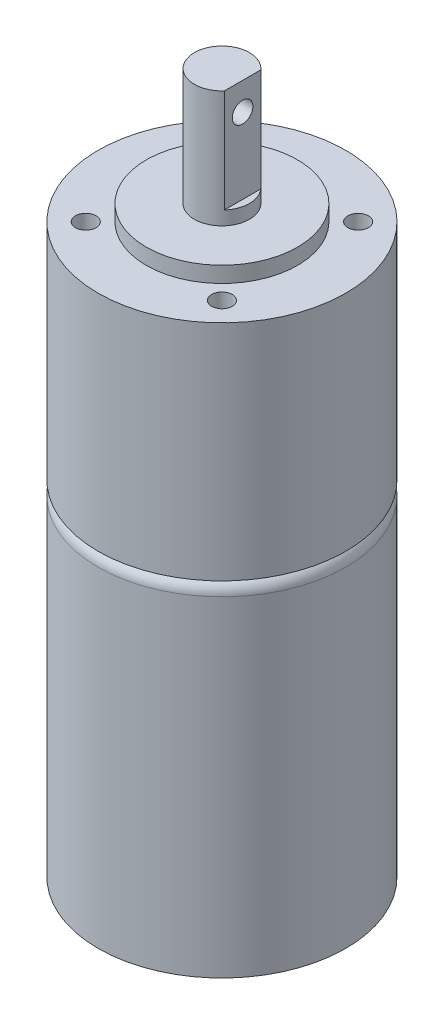
ISO-10303-21;
HEADER;
FILE_DESCRIPTION(('STEP AP214'),'2;1');
FILE_NAME('part.step','',(''),(''),'','','');
FILE_SCHEMA(('AUTOMOTIVE_DESIGN { 1 0 10303 214 1 1 1 1 }'));
ENDSEC;
DATA;
#1=APPLICATION_CONTEXT('core data for automotive mechanical design processes');
#2=APPLICATION_PROTOCOL_DEFINITION('international standard','automotive_design',2000,#1);
#3=PRODUCT_CONTEXT('',#1,'mechanical');
#4=PRODUCT('Part','Part','',(#3));
#5=PRODUCT_RELATED_PRODUCT_CATEGORY('part','',(#4));
#6=PRODUCT_DEFINITION_FORMATION('','',#4);
#7=PRODUCT_DEFINITION_CONTEXT('part definition',#1,'design');
#8=PRODUCT_DEFINITION('design','',#6,#7);
#9=PRODUCT_DEFINITION_SHAPE('','',#8);
#10=(LENGTH_UNIT() NAMED_UNIT(*) SI_UNIT(.MILLI.,.METRE.));
#11=(NAMED_UNIT(*) PLANE_ANGLE_UNIT() SI_UNIT($,.RADIAN.));
#12=(NAMED_UNIT(*) SI_UNIT($,.STERADIAN.) SOLID_ANGLE_UNIT());
#13=UNCERTAINTY_MEASURE_WITH_UNIT(LENGTH_MEASURE(1.E-05),#10,'distance_accuracy_value','');
#14=(GEOMETRIC_REPRESENTATION_CONTEXT(3) GLOBAL_UNCERTAINTY_ASSIGNED_CONTEXT((#13)) GLOBAL_UNIT_ASSIGNED_CONTEXT((#10,
#11,#12)) REPRESENTATION_CONTEXT('',''));
#15=CARTESIAN_POINT('',(0.,0.,0.));
#16=DIRECTION('',(0.,0.,1.));
#17=DIRECTION('',(1.,0.,0.));
#18=AXIS2_PLACEMENT_3D('',#15,#16,#17);
#19=CARTESIAN_POINT('',(0.,82.5,0.));
#20=DIRECTION('',(0.,1.,0.));
#21=DIRECTION('',(0.,0.,1.));
#22=AXIS2_PLACEMENT_3D('',#19,#20,#21);
#23=PLANE('',#22);
#24=CARTESIAN_POINT('',(-9.89949493661172,82.5,9.89949493661161));
#25=DIRECTION('',(0.,-1.,0.));
#26=DIRECTION('',(0.,0.,-1.));
#27=AXIS2_PLACEMENT_3D('',#24,#25,#26);
#28=CIRCLE('',#27,1.5);
#29=CARTESIAN_POINT('',(-9.89949493661172,82.5,8.39949493661162));
#30=VERTEX_POINT('',#29);
#31=EDGE_CURVE('E363',#30,#30,#28,.T.);
#32=ORIENTED_EDGE('',*,*,#31,.T.);
#33=EDGE_LOOP('',(#32));
#34=FACE_BOUND('',#33,.T.);
#35=CARTESIAN_POINT('',(9.89949493661172,82.5,9.89949493661161));
#36=DIRECTION('',(0.,1.,0.));
#37=DIRECTION('',(0.,0.,1.));
#38=AXIS2_PLACEMENT_3D('',#35,#36,#37);
#39=CIRCLE('',#38,1.5);
#40=CARTESIAN_POINT('',(9.89949493661172,82.5,11.3994949366116));
#41=VERTEX_POINT('',#40);
#42=EDGE_CURVE('E373',#41,#41,#39,.T.);
#43=ORIENTED_EDGE('',*,*,#42,.F.);
#44=EDGE_LOOP('',(#43));
#45=FACE_BOUND('',#44,.T.);
#46=CARTESIAN_POINT('',(-9.89949493661172,82.5,-9.89949493661161));
#47=DIRECTION('',(0.,1.,0.));
#48=DIRECTION('',(0.,0.,1.));
#49=AXIS2_PLACEMENT_3D('',#46,#47,#48);
#50=CIRCLE('',#49,1.5);
#51=CARTESIAN_POINT('',(-9.89949493661172,82.5,-8.3994949366116));
#52=VERTEX_POINT('',#51);
#53=EDGE_CURVE('E357',#52,#52,#50,.T.);
#54=ORIENTED_EDGE('',*,*,#53,.F.);
#55=EDGE_LOOP('',(#54));
#56=FACE_BOUND('',#55,.T.);
#57=CARTESIAN_POINT('',(0.,82.5,0.));
#58=DIRECTION('',(0.,1.,0.));
#59=DIRECTION('',(0.,0.,1.));
#60=AXIS2_PLACEMENT_3D('',#57,#58,#59);
#61=CIRCLE('',#60,11.);
#62=CARTESIAN_POINT('',(0.,82.5,11.));
#63=VERTEX_POINT('',#62);
#64=EDGE_CURVE('E91',#63,#63,#61,.T.);
#65=ORIENTED_EDGE('',*,*,#64,.F.);
#66=EDGE_LOOP('',(#65));
#67=FACE_BOUND('',#66,.T.);
#68=CARTESIAN_POINT('',(0.,82.5,0.));
#69=DIRECTION('',(0.,1.,0.));
#70=DIRECTION('',(0.,0.,1.));
#71=AXIS2_PLACEMENT_3D('',#68,#69,#70);
#72=CIRCLE('',#71,18.);
#73=CARTESIAN_POINT('',(0.,82.5,18.));
#74=VERTEX_POINT('',#73);
#75=EDGE_CURVE('E96',#74,#74,#72,.T.);
#76=ORIENTED_EDGE('',*,*,#75,.T.);
#77=EDGE_LOOP('',(#76));
#78=FACE_BOUND('',#77,.T.);
#79=CARTESIAN_POINT('',(9.89949493661172,82.5,-9.89949493661161));
#80=DIRECTION('',(0.,-1.,0.));
#81=DIRECTION('',(0.,0.,-1.));
#82=AXIS2_PLACEMENT_3D('',#79,#80,#81);
#83=CIRCLE('',#82,1.5);
#84=CARTESIAN_POINT('',(9.89949493661172,82.5,-11.3994949366116));
#85=VERTEX_POINT('',#84);
#86=EDGE_CURVE('E355',#85,#85,#83,.T.);
#87=ORIENTED_EDGE('',*,*,#86,.T.);
#88=EDGE_LOOP('',(#87));
#89=FACE_BOUND('',#88,.T.);
#90=ADVANCED_FACE('F40',(#34,#45,#56,#67,#78,#89),#23,.T.);
#91=CARTESIAN_POINT('',(0.,50.,0.));
#92=DIRECTION('',(0.,-1.,0.));
#93=DIRECTION('',(0.,0.,-1.));
#94=AXIS2_PLACEMENT_3D('',#91,#92,#93);
#95=CYLINDRICAL_SURFACE('',#94,18.);
#96=CARTESIAN_POINT('',(0.,48.,0.));
#97=DIRECTION('',(0.,1.,0.));
#98=DIRECTION('',(0.,0.,1.));
#99=AXIS2_PLACEMENT_3D('',#96,#97,#98);
#100=CIRCLE('',#99,18.);
#101=CARTESIAN_POINT('',(0.,48.,18.));
#102=VERTEX_POINT('',#101);
#103=EDGE_CURVE('E44',#102,#102,#100,.F.);
#104=ORIENTED_EDGE('',*,*,#103,.T.);
#105=EDGE_LOOP('',(#104));
#106=FACE_BOUND('',#105,.T.);
#107=CARTESIAN_POINT('',(0.,0.,0.));
#108=DIRECTION('',(0.,1.,0.));
#109=DIRECTION('',(0.,0.,1.));
#110=AXIS2_PLACEMENT_3D('',#107,#108,#109);
#111=CIRCLE('',#110,18.);
#112=CARTESIAN_POINT('',(0.,0.,18.));
#113=VERTEX_POINT('',#112);
#114=EDGE_CURVE('E104',#113,#113,#111,.T.);
#115=ORIENTED_EDGE('',*,*,#114,.T.);
#116=EDGE_LOOP('',(#115));
#117=FACE_BOUND('',#116,.T.);
#118=ADVANCED_FACE('F115',(#106,#117),#95,.T.);
#119=CARTESIAN_POINT('',(0.,0.,0.));
#120=DIRECTION('',(0.,1.,0.));
#121=DIRECTION('',(0.,0.,1.));
#122=AXIS2_PLACEMENT_3D('',#119,#120,#121);
#123=PLANE('',#122);
#124=CARTESIAN_POINT('',(0.,0.,0.));
#125=DIRECTION('',(0.,-1.,0.));
#126=DIRECTION('',(0.,0.,-1.));
#127=AXIS2_PLACEMENT_3D('',#124,#125,#126);
#128=CIRCLE('',#127,6.5);
#129=CARTESIAN_POINT('',(0.,0.,-6.5));
#130=VERTEX_POINT('',#129);
#131=EDGE_CURVE('E95',#130,#130,#128,.T.);
#132=ORIENTED_EDGE('',*,*,#131,.F.);
#133=EDGE_LOOP('',(#132));
#134=FACE_BOUND('',#133,.T.);
#135=ORIENTED_EDGE('',*,*,#114,.F.);
#136=EDGE_LOOP('',(#135));
#137=FACE_BOUND('',#136,.T.);
#138=ADVANCED_FACE('F121',(#134,#137),#123,.F.);
#139=CARTESIAN_POINT('',(0.,48.,0.));
#140=DIRECTION('',(0.,1.,0.));
#141=DIRECTION('',(0.,0.,1.));
#142=AXIS2_PLACEMENT_3D('',#139,#140,#141);
#143=TOROIDAL_SURFACE('',#142,16.,2.);
#144=ORIENTED_EDGE('',*,*,#103,.F.);
#145=EDGE_LOOP('',(#144));
#146=FACE_BOUND('',#145,.T.);
#147=CARTESIAN_POINT('',(0.,50.,0.));
#148=DIRECTION('',(0.,1.,0.));
#149=DIRECTION('',(0.,0.,1.));
#150=AXIS2_PLACEMENT_3D('',#147,#148,#149);
#151=CIRCLE('',#150,16.);
#152=CARTESIAN_POINT('',(0.,50.,16.));
#153=VERTEX_POINT('',#152);
#154=EDGE_CURVE('E108',#153,#153,#151,.T.);
#155=ORIENTED_EDGE('',*,*,#154,.F.);
#156=EDGE_LOOP('',(#155));
#157=FACE_BOUND('',#156,.T.);
#158=ADVANCED_FACE('F42',(#146,#157),#143,.T.);
#159=CARTESIAN_POINT('',(0.,-3.,0.));
#160=DIRECTION('',(0.,1.,0.));
#161=DIRECTION('',(0.,0.,1.));
#162=AXIS2_PLACEMENT_3D('',#159,#160,#161);
#163=CYLINDRICAL_SURFACE('',#162,6.5);
#164=CARTESIAN_POINT('',(0.,-3.,0.));
#165=DIRECTION('',(0.,-1.,0.));
#166=DIRECTION('',(0.,0.,-1.));
#167=AXIS2_PLACEMENT_3D('',#164,#165,#166);
#168=CIRCLE('',#167,6.5);
#169=CARTESIAN_POINT('',(0.,-3.,-6.5));
#170=VERTEX_POINT('',#169);
#171=EDGE_CURVE('E99',#170,#170,#168,.T.);
#172=ORIENTED_EDGE('',*,*,#171,.F.);
#173=EDGE_LOOP('',(#172));
#174=FACE_BOUND('',#173,.T.);
#175=ORIENTED_EDGE('',*,*,#131,.T.);
#176=EDGE_LOOP('',(#175));
#177=FACE_BOUND('',#176,.T.);
#178=ADVANCED_FACE('F120',(#174,#177),#163,.T.);
#179=CARTESIAN_POINT('',(0.,-3.,0.));
#180=DIRECTION('',(0.,-1.,0.));
#181=DIRECTION('',(0.,0.,-1.));
#182=AXIS2_PLACEMENT_3D('',#179,#180,#181);
#183=PLANE('',#182);
#184=CARTESIAN_POINT('',(0.,-3.,0.));
#185=DIRECTION('',(0.,-1.,0.));
#186=DIRECTION('',(0.,0.,-1.));
#187=AXIS2_PLACEMENT_3D('',#184,#185,#186);
#188=CIRCLE('',#187,1.585);
#189=CARTESIAN_POINT('',(0.,-3.,-1.585));
#190=VERTEX_POINT('',#189);
#191=EDGE_CURVE('E11',#190,#190,#188,.T.);
#192=ORIENTED_EDGE('',*,*,#191,.F.);
#193=EDGE_LOOP('',(#192));
#194=FACE_BOUND('',#193,.T.);
#195=ORIENTED_EDGE('',*,*,#171,.T.);
#196=EDGE_LOOP('',(#195));
#197=FACE_BOUND('',#196,.T.);
#198=ADVANCED_FACE('F126',(#194,#197),#183,.T.);
#199=CARTESIAN_POINT('',(0.,82.5,0.));
#200=DIRECTION('',(0.,-1.,0.));
#201=DIRECTION('',(0.,0.,-1.));
#202=AXIS2_PLACEMENT_3D('',#199,#200,#201);
#203=CYLINDRICAL_SURFACE('',#202,18.);
#204=ORIENTED_EDGE('',*,*,#75,.F.);
#205=EDGE_LOOP('',(#204));
#206=FACE_BOUND('',#205,.T.);
#207=CARTESIAN_POINT('',(0.,50.,0.));
#208=DIRECTION('',(0.,1.,0.));
#209=DIRECTION('',(0.,0.,1.));
#210=AXIS2_PLACEMENT_3D('',#207,#208,#209);
#211=CIRCLE('',#210,18.);
#212=CARTESIAN_POINT('',(0.,50.,18.));
#213=VERTEX_POINT('',#212);
#214=EDGE_CURVE('E86',#213,#213,#211,.T.);
#215=ORIENTED_EDGE('',*,*,#214,.T.);
#216=EDGE_LOOP('',(#215));
#217=FACE_BOUND('',#216,.T.);
#218=ADVANCED_FACE('F146',(#206,#217),#203,.T.);
#219=CARTESIAN_POINT('',(0.,50.,0.));
#220=DIRECTION('',(0.,1.,0.));
#221=DIRECTION('',(0.,0.,1.));
#222=AXIS2_PLACEMENT_3D('',#219,#220,#221);
#223=PLANE('',#222);
#224=ORIENTED_EDGE('',*,*,#154,.T.);
#225=EDGE_LOOP('',(#224));
#226=FACE_BOUND('',#225,.T.);
#227=ORIENTED_EDGE('',*,*,#214,.F.);
#228=EDGE_LOOP('',(#227));
#229=FACE_BOUND('',#228,.T.);
#230=ADVANCED_FACE('F143',(#226,#229),#223,.F.);
#231=CARTESIAN_POINT('',(0.,84.8,0.));
#232=DIRECTION('',(0.,-1.,0.));
#233=DIRECTION('',(0.,0.,-1.));
#234=AXIS2_PLACEMENT_3D('',#231,#232,#233);
#235=CYLINDRICAL_SURFACE('',#234,11.);
#236=CARTESIAN_POINT('',(0.,84.8,0.));
#237=DIRECTION('',(0.,1.,0.));
#238=DIRECTION('',(0.,0.,1.));
#239=AXIS2_PLACEMENT_3D('',#236,#237,#238);
#240=CIRCLE('',#239,11.);
#241=CARTESIAN_POINT('',(0.,84.8,11.));
#242=VERTEX_POINT('',#241);
#243=EDGE_CURVE('E83',#242,#242,#240,.T.);
#244=ORIENTED_EDGE('',*,*,#243,.F.);
#245=EDGE_LOOP('',(#244));
#246=FACE_BOUND('',#245,.T.);
#247=ORIENTED_EDGE('',*,*,#64,.T.);
#248=EDGE_LOOP('',(#247));
#249=FACE_BOUND('',#248,.T.);
#250=ADVANCED_FACE('F141',(#246,#249),#235,.T.);
#251=CARTESIAN_POINT('',(0.,84.8,0.));
#252=DIRECTION('',(0.,1.,0.));
#253=DIRECTION('',(0.,0.,1.));
#254=AXIS2_PLACEMENT_3D('',#251,#252,#253);
#255=PLANE('',#254);
#256=CARTESIAN_POINT('',(0.,84.8,0.));
#257=DIRECTION('',(0.,1.,0.));
#258=DIRECTION('',(0.,0.,1.));
#259=AXIS2_PLACEMENT_3D('',#256,#257,#258);
#260=CIRCLE('',#259,4.);
#261=CARTESIAN_POINT('',(0.,84.8,4.));
#262=VERTEX_POINT('',#261);
#263=EDGE_CURVE('E49',#262,#262,#260,.T.);
#264=ORIENTED_EDGE('',*,*,#263,.F.);
#265=EDGE_LOOP('',(#264));
#266=FACE_BOUND('',#265,.T.);
#267=ORIENTED_EDGE('',*,*,#243,.T.);
#268=EDGE_LOOP('',(#267));
#269=FACE_BOUND('',#268,.T.);
#270=ADVANCED_FACE('F219',(#266,#269),#255,.T.);
#271=CARTESIAN_POINT('',(0.,101.8,0.));
#272=DIRECTION('',(0.,-1.,0.));
#273=DIRECTION('',(0.,0.,-1.));
#274=AXIS2_PLACEMENT_3D('',#271,#272,#273);
#275=CYLINDRICAL_SURFACE('',#274,4.);
#276=CARTESIAN_POINT('',(-4.,96.3,0.));
#277=CARTESIAN_POINT('',(-4.00000217456151,96.2999970976969,-0.0812350589378532));
#278=CARTESIAN_POINT('',(-3.99750379283184,96.3066197602484,-0.162450241781792));
#279=CARTESIAN_POINT('',(-3.98778696006928,96.3328281952699,-0.322453452352362));
#280=CARTESIAN_POINT('',(-3.98056918893993,96.3524121004706,-0.401241827987617));
#281=CARTESIAN_POINT('',(-3.96218832391545,96.4037530017718,-0.554060784990879));
#282=CARTESIAN_POINT('',(-3.9510328434944,96.4354865168218,-0.628100224162276));
#283=CARTESIAN_POINT('',(-3.92588767765353,96.5101064130158,-0.769799310160252));
#284=CARTESIAN_POINT('',(-3.91189723227548,96.5529957855441,-0.83745723917788));
#285=CARTESIAN_POINT('',(-3.88186246971217,96.6506125310709,-0.967346417045831));
#286=CARTESIAN_POINT('',(-3.86576002583566,96.7057302622594,-1.0292707301512));
#287=CARTESIAN_POINT('',(-3.83360220871326,96.8254104346588,-1.14324421474364));
#288=CARTESIAN_POINT('',(-3.81754685135032,96.8899757560879,-1.19529036359203));
#289=CARTESIAN_POINT('',(-3.78662470617731,97.0297174675232,-1.28998202215985));
#290=CARTESIAN_POINT('',(-3.77182648820818,97.1052043665458,-1.3321939319576));
#291=CARTESIAN_POINT('',(-3.74599860237433,97.2628483541685,-1.40318646334084));
#292=CARTESIAN_POINT('',(-3.73496742975881,97.3450027631551,-1.43197244961239));
#293=CARTESIAN_POINT('',(-3.71854412824136,97.5101167402582,-1.47408431017549));
#294=CARTESIAN_POINT('',(-3.71293924350838,97.5929050384354,-1.48799593218558));
#295=CARTESIAN_POINT('',(-3.70738061461215,97.7598161579938,-1.50179556531648));
#296=CARTESIAN_POINT('',(-3.70742453659305,97.8439384138745,-1.50168936802631));
#297=CARTESIAN_POINT('',(-3.71297511632055,98.005769525213,-1.48790429610018));
#298=CARTESIAN_POINT('',(-3.71815468871122,98.0835609060442,-1.47503808509003));
#299=CARTESIAN_POINT('',(-3.7328493805953,98.2357871504053,-1.4374416786833));
#300=CARTESIAN_POINT('',(-3.74236515298863,98.3102215066139,-1.41270969663258));
#301=CARTESIAN_POINT('',(-3.76485702190253,98.4552770677282,-1.35163748571903));
#302=CARTESIAN_POINT('',(-3.77789517988166,98.5257994861213,-1.315086487371));
#303=CARTESIAN_POINT('',(-3.8059421013932,98.659945737591,-1.23156073762697));
#304=CARTESIAN_POINT('',(-3.82095154457158,98.7235671775197,-1.18458238728896));
#305=CARTESIAN_POINT('',(-3.85248038859113,98.8466036636509,-1.07781780766549));
#306=CARTESIAN_POINT('',(-3.86903347455671,98.9054486407481,-1.01738298716955));
#307=CARTESIAN_POINT('',(-3.90091728164086,99.0123379662058,-0.887312590819016));
#308=CARTESIAN_POINT('',(-3.91624781465952,99.0603806546057,-0.81767560349736));
#309=CARTESIAN_POINT('',(-3.9442639480908,99.1449303970625,-0.669723436992419));
#310=CARTESIAN_POINT('',(-3.95690498259616,99.1812475812211,-0.591290713844721));
#311=CARTESIAN_POINT('',(-3.97778718326962,99.23998260427,-0.428836850524587));
#312=CARTESIAN_POINT('',(-3.98603030341493,99.2624066165611,-0.344818210845771));
#313=CARTESIAN_POINT('',(-3.99684443228065,99.2916227875419,-0.178375243148668));
#314=CARTESIAN_POINT('',(-3.99969369025686,99.2991826063825,-0.0961036195622117));
#315=CARTESIAN_POINT('',(-4.00025893700126,99.3006910638999,0.0685724752550237));
#316=CARTESIAN_POINT('',(-3.99797606386863,99.2946427203168,0.150976912983373));
#317=CARTESIAN_POINT('',(-3.98871709772643,99.2696899576913,0.310262048561861));
#318=CARTESIAN_POINT('',(-3.98192470962305,99.2512884562629,0.387233328007338));
#319=CARTESIAN_POINT('',(-3.96451477091717,99.2028139274527,0.536941754957221));
#320=CARTESIAN_POINT('',(-3.9538967228203,99.172739382052,0.609678350347533));
#321=CARTESIAN_POINT('',(-3.92949624407682,99.1008135875605,0.751247765110154));
#322=CARTESIAN_POINT('',(-3.91563000209348,99.0586422707766,0.819903083557795));
#323=CARTESIAN_POINT('',(-3.88626671564664,98.9640818968285,0.949392711726625));
#324=CARTESIAN_POINT('',(-3.87076907009516,98.9116890674548,1.01022412027045));
#325=CARTESIAN_POINT('',(-3.8387332949099,98.7945958778757,1.12603079874454));
#326=CARTESIAN_POINT('',(-3.82218696503729,98.7293578172273,1.18046154123568));
#327=CARTESIAN_POINT('',(-3.79078815746854,98.5903486152923,1.27771050031903));
#328=CARTESIAN_POINT('',(-3.77593583194399,98.5165767086115,1.32052767414519));
#329=CARTESIAN_POINT('',(-3.74966829822463,98.3619840132277,1.39337773518998));
#330=CARTESIAN_POINT('',(-3.73826760328493,98.2811352540896,1.42335685446918));
#331=CARTESIAN_POINT('',(-3.72054032891005,98.1149902363122,1.46907883466889));
#332=CARTESIAN_POINT('',(-3.71421061057491,98.0296967638019,1.48483050305535));
#333=CARTESIAN_POINT('',(-3.70775894792573,97.8629838404589,1.50086347097839));
#334=CARTESIAN_POINT('',(-3.70726444523341,97.7816673682831,1.50207331495837));
#335=CARTESIAN_POINT('',(-3.71158412745292,97.6200546837238,1.49136715641593));
#336=CARTESIAN_POINT('',(-3.71639780898899,97.5397583753284,1.47945239850124));
#337=CARTESIAN_POINT('',(-3.73048141585432,97.3849527732834,1.44355815630242));
#338=CARTESIAN_POINT('',(-3.73961085376663,97.3103416537547,1.41995798316524));
#339=CARTESIAN_POINT('',(-3.76121548297845,97.1660944915056,1.3616969677992));
#340=CARTESIAN_POINT('',(-3.77369151995215,97.0964597119299,1.32703332944945));
#341=CARTESIAN_POINT('',(-3.80139723903964,96.9601732103024,1.24552075938154));
#342=CARTESIAN_POINT('',(-3.81673698440964,96.8938692032001,1.19812832803011));
#343=CARTESIAN_POINT('',(-3.84806246757177,96.7698584390288,1.09334485729907));
#344=CARTESIAN_POINT('',(-3.86404840943145,96.7121544252133,1.03595064012809));
#345=CARTESIAN_POINT('',(-3.89590424609881,96.6037980441782,0.90908039678463));
#346=CARTESIAN_POINT('',(-3.91172104900645,96.5536962465653,0.839118644212999));
#347=CARTESIAN_POINT('',(-3.9405451445703,96.4659773447234,0.691213223200825));
#348=CARTESIAN_POINT('',(-3.95355221851559,96.4283612122636,0.613268934090625));
#349=CARTESIAN_POINT('',(-3.9757429260668,96.3656231709517,0.447999082002313));
#350=CARTESIAN_POINT('',(-3.98473657158356,96.3411129353981,0.360413422234209));
#351=CARTESIAN_POINT('',(-3.99686242179587,96.3083070400793,0.181875733606381));
#352=CARTESIAN_POINT('',(-3.99999756603967,96.3000032485127,0.0909254163648582));
#353=CARTESIAN_POINT('',(-4.,96.3,0.));
#354=B_SPLINE_CURVE_WITH_KNOTS('',3,(#276,#277,#278,#279,#280,#281,#282,#283,#284,#285,#286,
#287,#288,#289,#290,#291,#292,#293,#294,#295,#296,#297,#298,#299,#300,#301,#302,#303,#304,#305,
#306,#307,#308,#309,#310,#311,#312,#313,#314,#315,#316,#317,#318,#319,#320,#321,#322,#323,#324,
#325,#326,#327,#328,#329,#330,#331,#332,#333,#334,#335,#336,#337,#338,#339,#340,#341,#342,#343,
#344,#345,#346,#347,#348,#349,#350,#351,#352,#353),.UNSPECIFIED.,.T.,.F.,(4,2,2,2,2,2,2,2,2,2,2,
2,2,2,2,2,2,2,2,2,2,2,2,2,2,2,2,2,2,2,2,2,2,2,2,2,2,2,4),(0.,0.243369801560561,
0.486704549530459,0.729571369213573,0.972503379609487,1.22473618582717,1.47704604925623,
1.73896674501658,2.00078269352134,2.25185874416901,2.50283106079708,2.73878345119974,
2.97477138060591,3.21522408387019,3.45575990744259,3.71246153335814,3.96920257905066,
4.22991375286075,4.49050899698846,4.73725019635926,4.98393668390521,5.2211443792384,
5.45838293254454,5.70259221859599,5.94689180019868,6.20536519455659,6.46386178920142,
6.72343066727203,6.98283874956506,7.22558763480251,7.46831350211259,7.70363142426533,
7.93900886656507,8.1867247188427,8.43451941997061,8.69572329654039,8.95694749805102,
9.22948515032043,9.50188601796128),.UNSPECIFIED.);
#355=CARTESIAN_POINT('',(-4.,96.3,0.));
#356=VERTEX_POINT('',#355);
#357=EDGE_CURVE('E222',#356,#356,#354,.T.);
#358=ORIENTED_EDGE('',*,*,#357,.T.);
#359=EDGE_LOOP('',(#358));
#360=FACE_BOUND('',#359,.T.);
#361=CARTESIAN_POINT('',(0.,101.8,0.));
#362=DIRECTION('',(0.,1.,0.));
#363=DIRECTION('',(0.,0.,1.));
#364=AXIS2_PLACEMENT_3D('',#361,#362,#363);
#365=CIRCLE('',#364,4.);
#366=CARTESIAN_POINT('',(3.,101.8,-2.64575131106459));
#367=VERTEX_POINT('',#366);
#368=CARTESIAN_POINT('',(3.,101.8,2.64575131106459));
#369=VERTEX_POINT('',#368);
#370=EDGE_CURVE('E80',#367,#369,#365,.T.);
#371=ORIENTED_EDGE('',*,*,#370,.F.);
#372=DIRECTION('',(0.,1.,0.));
#373=VECTOR('',#372,1.);
#374=CARTESIAN_POINT('',(3.,86.8,-2.64575131106459));
#375=LINE('',#374,#373);
#376=CARTESIAN_POINT('',(3.,86.8,-2.64575131106459));
#377=VERTEX_POINT('',#376);
#378=EDGE_CURVE('E57',#377,#367,#375,.T.);
#379=ORIENTED_EDGE('',*,*,#378,.F.);
#380=CARTESIAN_POINT('',(0.,86.8,0.));
#381=DIRECTION('',(0.,1.,0.));
#382=DIRECTION('',(0.,0.,1.));
#383=AXIS2_PLACEMENT_3D('',#380,#381,#382);
#384=CIRCLE('',#383,4.);
#385=CARTESIAN_POINT('',(3.,86.8,2.64575131106459));
#386=VERTEX_POINT('',#385);
#387=EDGE_CURVE('E73',#386,#377,#384,.T.);
#388=ORIENTED_EDGE('',*,*,#387,.F.);
#389=DIRECTION('',(0.,1.,0.));
#390=VECTOR('',#389,1.);
#391=CARTESIAN_POINT('',(3.,86.8,2.64575131106459));
#392=LINE('',#391,#390);
#393=EDGE_CURVE('E63',#386,#369,#392,.T.);
#394=ORIENTED_EDGE('',*,*,#393,.T.);
#395=EDGE_LOOP('',(#371,#379,#388,#394));
#396=FACE_BOUND('',#395,.T.);
#397=ORIENTED_EDGE('',*,*,#263,.T.);
#398=EDGE_LOOP('',(#397));
#399=FACE_BOUND('',#398,.T.);
#400=ADVANCED_FACE('F78',(#360,#396,#399),#275,.T.);
#401=CARTESIAN_POINT('',(0.,101.8,0.));
#402=DIRECTION('',(0.,1.,0.));
#403=DIRECTION('',(0.,0.,1.));
#404=AXIS2_PLACEMENT_3D('',#401,#402,#403);
#405=PLANE('',#404);
#406=DIRECTION('',(0.,0.,1.));
#407=VECTOR('',#406,1.);
#408=CARTESIAN_POINT('',(3.,101.8,0.));
#409=LINE('',#408,#407);
#410=EDGE_CURVE('E68',#367,#369,#409,.T.);
#411=ORIENTED_EDGE('',*,*,#410,.F.);
#412=ORIENTED_EDGE('',*,*,#370,.T.);
#413=EDGE_LOOP('',(#411,#412));
#414=FACE_BOUND('',#413,.T.);
#415=ADVANCED_FACE('F82',(#414),#405,.T.);
#416=CARTESIAN_POINT('',(3.,86.8,0.));
#417=DIRECTION('',(-1.,0.,0.));
#418=DIRECTION('',(0.,0.,1.));
#419=AXIS2_PLACEMENT_3D('',#416,#417,#418);
#420=PLANE('',#419);
#421=CARTESIAN_POINT('',(3.,97.8,0.));
#422=DIRECTION('',(1.,0.,0.));
#423=DIRECTION('',(0.,0.,-1.));
#424=AXIS2_PLACEMENT_3D('',#421,#422,#423);
#425=CIRCLE('',#424,1.5);
#426=CARTESIAN_POINT('',(3.,97.8,-1.5));
#427=VERTEX_POINT('',#426);
#428=EDGE_CURVE('E230',#427,#427,#425,.T.);
#429=ORIENTED_EDGE('',*,*,#428,.F.);
#430=EDGE_LOOP('',(#429));
#431=FACE_BOUND('',#430,.T.);
#432=ORIENTED_EDGE('',*,*,#410,.T.);
#433=ORIENTED_EDGE('',*,*,#393,.F.);
#434=DIRECTION('',(0.,0.,1.));
#435=VECTOR('',#434,1.);
#436=CARTESIAN_POINT('',(3.,86.8,0.));
#437=LINE('',#436,#435);
#438=EDGE_CURVE('E377',#377,#386,#437,.T.);
#439=ORIENTED_EDGE('',*,*,#438,.F.);
#440=ORIENTED_EDGE('',*,*,#378,.T.);
#441=EDGE_LOOP('',(#432,#433,#439,#440));
#442=FACE_BOUND('',#441,.T.);
#443=ADVANCED_FACE('F69',(#431,#442),#420,.F.);
#444=CARTESIAN_POINT('',(0.,86.8,0.));
#445=DIRECTION('',(0.,1.,0.));
#446=DIRECTION('',(0.,0.,1.));
#447=AXIS2_PLACEMENT_3D('',#444,#445,#446);
#448=PLANE('',#447);
#449=ORIENTED_EDGE('',*,*,#387,.T.);
#450=ORIENTED_EDGE('',*,*,#438,.T.);
#451=EDGE_LOOP('',(#449,#450));
#452=FACE_BOUND('',#451,.T.);
#453=ADVANCED_FACE('F207',(#452),#448,.T.);
#454=CARTESIAN_POINT('',(-9.89949493661172,74.5,-9.89949493661161));
#455=DIRECTION('',(0.,1.,0.));
#456=DIRECTION('',(0.,0.,1.));
#457=AXIS2_PLACEMENT_3D('',#454,#455,#456);
#458=CYLINDRICAL_SURFACE('',#457,1.5);
#459=CARTESIAN_POINT('',(-9.89949493661172,74.5,-9.89949493661161));
#460=DIRECTION('',(0.,1.,0.));
#461=DIRECTION('',(0.,0.,1.));
#462=AXIS2_PLACEMENT_3D('',#459,#460,#461);
#463=CIRCLE('',#462,1.5);
#464=CARTESIAN_POINT('',(-9.89949493661172,74.5,-8.3994949366116));
#465=VERTEX_POINT('',#464);
#466=EDGE_CURVE('E74',#465,#465,#463,.T.);
#467=ORIENTED_EDGE('',*,*,#466,.F.);
#468=EDGE_LOOP('',(#467));
#469=FACE_BOUND('',#468,.T.);
#470=ORIENTED_EDGE('',*,*,#53,.T.);
#471=EDGE_LOOP('',(#470));
#472=FACE_BOUND('',#471,.T.);
#473=ADVANCED_FACE('F203',(#469,#472),#458,.F.);
#474=CARTESIAN_POINT('',(-9.89949493661172,74.5,-9.89949493661161));
#475=DIRECTION('',(0.,1.,0.));
#476=DIRECTION('',(0.,0.,1.));
#477=AXIS2_PLACEMENT_3D('',#474,#475,#476);
#478=PLANE('',#477);
#479=ORIENTED_EDGE('',*,*,#466,.T.);
#480=EDGE_LOOP('',(#479));
#481=FACE_BOUND('',#480,.T.);
#482=ADVANCED_FACE('F185',(#481),#478,.T.);
#483=CARTESIAN_POINT('',(9.89949493661172,74.5,9.89949493661161));
#484=DIRECTION('',(0.,1.,0.));
#485=DIRECTION('',(0.,0.,1.));
#486=AXIS2_PLACEMENT_3D('',#483,#484,#485);
#487=CYLINDRICAL_SURFACE('',#486,1.5);
#488=CARTESIAN_POINT('',(9.89949493661172,74.5,9.89949493661161));
#489=DIRECTION('',(0.,1.,0.));
#490=DIRECTION('',(0.,0.,1.));
#491=AXIS2_PLACEMENT_3D('',#488,#489,#490);
#492=CIRCLE('',#491,1.5);
#493=CARTESIAN_POINT('',(9.89949493661172,74.5,11.3994949366116));
#494=VERTEX_POINT('',#493);
#495=EDGE_CURVE('E366',#494,#494,#492,.T.);
#496=ORIENTED_EDGE('',*,*,#495,.F.);
#497=EDGE_LOOP('',(#496));
#498=FACE_BOUND('',#497,.T.);
#499=ORIENTED_EDGE('',*,*,#42,.T.);
#500=EDGE_LOOP('',(#499));
#501=FACE_BOUND('',#500,.T.);
#502=ADVANCED_FACE('F181',(#498,#501),#487,.F.);
#503=CARTESIAN_POINT('',(9.89949493661172,74.5,9.89949493661161));
#504=DIRECTION('',(0.,1.,0.));
#505=DIRECTION('',(0.,0.,1.));
#506=AXIS2_PLACEMENT_3D('',#503,#504,#505);
#507=PLANE('',#506);
#508=ORIENTED_EDGE('',*,*,#495,.T.);
#509=EDGE_LOOP('',(#508));
#510=FACE_BOUND('',#509,.T.);
#511=ADVANCED_FACE('F184',(#510),#507,.T.);
#512=CARTESIAN_POINT('',(-9.89949493661172,74.5,9.89949493661161));
#513=DIRECTION('',(0.,1.,0.));
#514=DIRECTION('',(0.,0.,1.));
#515=AXIS2_PLACEMENT_3D('',#512,#513,#514);
#516=CYLINDRICAL_SURFACE('',#515,1.5);
#517=CARTESIAN_POINT('',(-9.89949493661172,74.5,9.89949493661161));
#518=DIRECTION('',(0.,-1.,0.));
#519=DIRECTION('',(0.,0.,-1.));
#520=AXIS2_PLACEMENT_3D('',#517,#518,#519);
#521=CIRCLE('',#520,1.5);
#522=CARTESIAN_POINT('',(-9.89949493661172,74.5,8.39949493661162));
#523=VERTEX_POINT('',#522);
#524=EDGE_CURVE('E370',#523,#523,#521,.T.);
#525=ORIENTED_EDGE('',*,*,#524,.T.);
#526=EDGE_LOOP('',(#525));
#527=FACE_BOUND('',#526,.T.);
#528=ORIENTED_EDGE('',*,*,#31,.F.);
#529=EDGE_LOOP('',(#528));
#530=FACE_BOUND('',#529,.T.);
#531=ADVANCED_FACE('F189',(#527,#530),#516,.F.);
#532=CARTESIAN_POINT('',(-9.89949493661172,74.5,9.89949493661161));
#533=DIRECTION('',(0.,-1.,0.));
#534=DIRECTION('',(0.,0.,-1.));
#535=AXIS2_PLACEMENT_3D('',#532,#533,#534);
#536=PLANE('',#535);
#537=ORIENTED_EDGE('',*,*,#524,.F.);
#538=EDGE_LOOP('',(#537));
#539=FACE_BOUND('',#538,.T.);
#540=ADVANCED_FACE('F192',(#539),#536,.F.);
#541=CARTESIAN_POINT('',(9.89949493661172,74.5,-9.89949493661161));
#542=DIRECTION('',(0.,1.,0.));
#543=DIRECTION('',(0.,0.,1.));
#544=AXIS2_PLACEMENT_3D('',#541,#542,#543);
#545=CYLINDRICAL_SURFACE('',#544,1.5);
#546=CARTESIAN_POINT('',(9.89949493661172,74.5,-9.89949493661161));
#547=DIRECTION('',(0.,-1.,0.));
#548=DIRECTION('',(0.,0.,-1.));
#549=AXIS2_PLACEMENT_3D('',#546,#547,#548);
#550=CIRCLE('',#549,1.5);
#551=CARTESIAN_POINT('',(9.89949493661172,74.5,-11.3994949366116));
#552=VERTEX_POINT('',#551);
#553=EDGE_CURVE('E358',#552,#552,#550,.T.);
#554=ORIENTED_EDGE('',*,*,#553,.T.);
#555=EDGE_LOOP('',(#554));
#556=FACE_BOUND('',#555,.T.);
#557=ORIENTED_EDGE('',*,*,#86,.F.);
#558=EDGE_LOOP('',(#557));
#559=FACE_BOUND('',#558,.T.);
#560=ADVANCED_FACE('F175',(#556,#559),#545,.F.);
#561=CARTESIAN_POINT('',(9.89949493661172,74.5,-9.89949493661161));
#562=DIRECTION('',(0.,-1.,0.));
#563=DIRECTION('',(0.,0.,-1.));
#564=AXIS2_PLACEMENT_3D('',#561,#562,#563);
#565=PLANE('',#564);
#566=ORIENTED_EDGE('',*,*,#553,.F.);
#567=EDGE_LOOP('',(#566));
#568=FACE_BOUND('',#567,.T.);
#569=ADVANCED_FACE('F165',(#568),#565,.F.);
#570=CARTESIAN_POINT('',(0.,-5.,0.));
#571=DIRECTION('',(0.,1.,0.));
#572=DIRECTION('',(0.,0.,1.));
#573=AXIS2_PLACEMENT_3D('',#570,#571,#572);
#574=CYLINDRICAL_SURFACE('',#573,1.585);
#575=CARTESIAN_POINT('',(0.,-5.,0.));
#576=DIRECTION('',(0.,-1.,0.));
#577=DIRECTION('',(0.,0.,-1.));
#578=AXIS2_PLACEMENT_3D('',#575,#576,#577);
#579=CIRCLE('',#578,1.585);
#580=CARTESIAN_POINT('',(0.,-5.,-1.585));
#581=VERTEX_POINT('',#580);
#582=EDGE_CURVE('E229',#581,#581,#579,.T.);
#583=ORIENTED_EDGE('',*,*,#582,.F.);
#584=EDGE_LOOP('',(#583));
#585=FACE_BOUND('',#584,.T.);
#586=ORIENTED_EDGE('',*,*,#191,.T.);
#587=EDGE_LOOP('',(#586));
#588=FACE_BOUND('',#587,.T.);
#589=ADVANCED_FACE('F162',(#585,#588),#574,.T.);
#590=CARTESIAN_POINT('',(0.,-5.,0.));
#591=DIRECTION('',(0.,-1.,0.));
#592=DIRECTION('',(0.,0.,-1.));
#593=AXIS2_PLACEMENT_3D('',#590,#591,#592);
#594=PLANE('',#593);
#595=ORIENTED_EDGE('',*,*,#582,.T.);
#596=EDGE_LOOP('',(#595));
#597=FACE_BOUND('',#596,.T.);
#598=ADVANCED_FACE('F164',(#597),#594,.T.);
#599=CARTESIAN_POINT('',(-4.,97.8,0.));
#600=DIRECTION('',(1.,0.,0.));
#601=DIRECTION('',(0.,0.,-1.));
#602=AXIS2_PLACEMENT_3D('',#599,#600,#601);
#603=CYLINDRICAL_SURFACE('',#602,1.5);
#604=ORIENTED_EDGE('',*,*,#428,.T.);
#605=EDGE_LOOP('',(#604));
#606=FACE_BOUND('',#605,.T.);
#607=ORIENTED_EDGE('',*,*,#357,.F.);
#608=EDGE_LOOP('',(#607));
#609=FACE_BOUND('',#608,.T.);
#610=ADVANCED_FACE('F172',(#606,#609),#603,.F.);
#611=CLOSED_SHELL('',(#90,#118,#138,#158,#178,#198,#218,#230,#250,#270,#400,#415,#443,#453,#473,
#482,#502,#511,#531,#540,#560,#569,#589,#598,#610));
#612=MANIFOLD_SOLID_BREP('B2',#611);
#613=ADVANCED_BREP_SHAPE_REPRESENTATION('',(#18,#612),#14);
#614=SHAPE_DEFINITION_REPRESENTATION(#9,#613);
ENDSEC;
END-ISO-10303-21;
